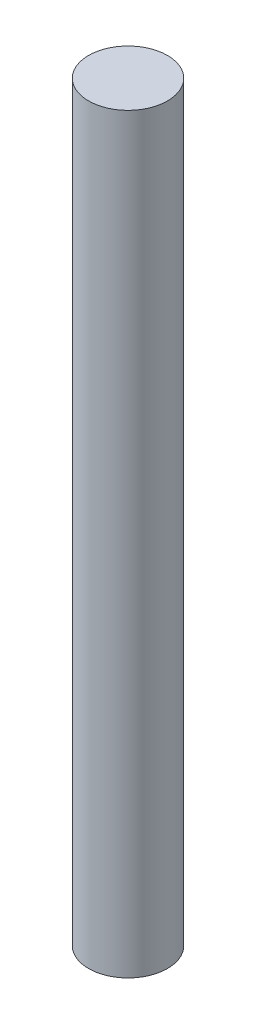
ISO-10303-21;
HEADER;
FILE_DESCRIPTION(('STEP AP214'),'2;1');
FILE_NAME('part.step','',(''),(''),'','','');
FILE_SCHEMA(('AUTOMOTIVE_DESIGN { 1 0 10303 214 1 1 1 1 }'));
ENDSEC;
DATA;
#1=APPLICATION_CONTEXT('core data for automotive mechanical design processes');
#2=APPLICATION_PROTOCOL_DEFINITION('international standard','automotive_design',2000,#1);
#3=PRODUCT_CONTEXT('',#1,'mechanical');
#4=PRODUCT('Part','Part','',(#3));
#5=PRODUCT_RELATED_PRODUCT_CATEGORY('part','',(#4));
#6=PRODUCT_DEFINITION_FORMATION('','',#4);
#7=PRODUCT_DEFINITION_CONTEXT('part definition',#1,'design');
#8=PRODUCT_DEFINITION('design','',#6,#7);
#9=PRODUCT_DEFINITION_SHAPE('','',#8);
#10=(LENGTH_UNIT() NAMED_UNIT(*) SI_UNIT(.MILLI.,.METRE.));
#11=(NAMED_UNIT(*) PLANE_ANGLE_UNIT() SI_UNIT($,.RADIAN.));
#12=(NAMED_UNIT(*) SI_UNIT($,.STERADIAN.) SOLID_ANGLE_UNIT());
#13=UNCERTAINTY_MEASURE_WITH_UNIT(LENGTH_MEASURE(1.E-05),#10,'distance_accuracy_value','');
#14=(GEOMETRIC_REPRESENTATION_CONTEXT(3) GLOBAL_UNCERTAINTY_ASSIGNED_CONTEXT((#13)) GLOBAL_UNIT_ASSIGNED_CONTEXT((#10,
#11,#12)) REPRESENTATION_CONTEXT('',''));
#15=CARTESIAN_POINT('',(0.,0.,0.));
#16=DIRECTION('',(0.,0.,1.));
#17=DIRECTION('',(1.,0.,0.));
#18=AXIS2_PLACEMENT_3D('',#15,#16,#17);
#19=CARTESIAN_POINT('',(0.,76.2,0.));
#20=DIRECTION('',(0.,-1.,0.));
#21=DIRECTION('',(0.,0.,-1.));
#22=AXIS2_PLACEMENT_3D('',#19,#20,#21);
#23=CYLINDRICAL_SURFACE('',#22,4.);
#24=CARTESIAN_POINT('',(0.,76.2,0.));
#25=DIRECTION('',(0.,1.,0.));
#26=DIRECTION('',(0.,0.,1.));
#27=AXIS2_PLACEMENT_3D('',#24,#25,#26);
#28=CIRCLE('',#27,4.);
#29=CARTESIAN_POINT('',(0.,76.2,-4.));
#30=VERTEX_POINT('',#29);
#31=EDGE_CURVE('E10',#30,#30,#28,.T.);
#32=CARTESIAN_POINT('',(0.,0.,0.));
#33=DIRECTION('',(0.,1.,0.));
#34=DIRECTION('',(0.,0.,1.));
#35=AXIS2_PLACEMENT_3D('',#32,#33,#34);
#36=CIRCLE('',#35,4.);
#37=CARTESIAN_POINT('',(0.,0.,-4.));
#38=VERTEX_POINT('',#37);
#39=EDGE_CURVE('E34',#38,#38,#36,.T.);
#40=CARTESIAN_POINT('',(0.,76.2,-4.));
#41=CARTESIAN_POINT('',(0.,75.40625,-4.));
#42=CARTESIAN_POINT('',(0.,74.6125,-4.));
#43=CARTESIAN_POINT('',(0.,73.025,-4.));
#44=CARTESIAN_POINT('',(0.,72.23125,-4.));
#45=CARTESIAN_POINT('',(0.,70.64375,-4.));
#46=CARTESIAN_POINT('',(0.,69.85,-4.));
#47=CARTESIAN_POINT('',(0.,68.2625,-4.));
#48=CARTESIAN_POINT('',(0.,67.46875,-4.));
#49=CARTESIAN_POINT('',(0.,65.88125,-4.));
#50=CARTESIAN_POINT('',(0.,65.0875,-4.));
#51=CARTESIAN_POINT('',(0.,63.5,-4.));
#52=CARTESIAN_POINT('',(0.,62.70625,-4.));
#53=CARTESIAN_POINT('',(0.,61.11875,-4.));
#54=CARTESIAN_POINT('',(0.,60.325,-4.));
#55=CARTESIAN_POINT('',(0.,58.7375,-4.));
#56=CARTESIAN_POINT('',(0.,57.94375,-4.));
#57=CARTESIAN_POINT('',(0.,56.35625,-4.));
#58=CARTESIAN_POINT('',(0.,55.5625,-4.));
#59=CARTESIAN_POINT('',(0.,53.975,-4.));
#60=CARTESIAN_POINT('',(0.,53.18125,-4.));
#61=CARTESIAN_POINT('',(0.,51.59375,-4.));
#62=CARTESIAN_POINT('',(0.,50.8,-4.));
#63=CARTESIAN_POINT('',(0.,49.2125,-4.));
#64=CARTESIAN_POINT('',(0.,48.41875,-4.));
#65=CARTESIAN_POINT('',(0.,46.83125,-4.));
#66=CARTESIAN_POINT('',(0.,46.0375,-4.));
#67=CARTESIAN_POINT('',(0.,44.45,-4.));
#68=CARTESIAN_POINT('',(0.,43.65625,-4.));
#69=CARTESIAN_POINT('',(0.,42.06875,-4.));
#70=CARTESIAN_POINT('',(0.,41.275,-4.));
#71=CARTESIAN_POINT('',(0.,39.6875,-4.));
#72=CARTESIAN_POINT('',(0.,38.89375,-4.));
#73=CARTESIAN_POINT('',(0.,37.30625,-4.));
#74=CARTESIAN_POINT('',(0.,36.5125,-4.));
#75=CARTESIAN_POINT('',(0.,34.925,-4.));
#76=CARTESIAN_POINT('',(0.,34.13125,-4.));
#77=CARTESIAN_POINT('',(0.,32.54375,-4.));
#78=CARTESIAN_POINT('',(0.,31.75,-4.));
#79=CARTESIAN_POINT('',(0.,30.1625,-4.));
#80=CARTESIAN_POINT('',(0.,29.36875,-4.));
#81=CARTESIAN_POINT('',(0.,27.78125,-4.));
#82=CARTESIAN_POINT('',(0.,26.9875,-4.));
#83=CARTESIAN_POINT('',(0.,25.4,-4.));
#84=CARTESIAN_POINT('',(0.,24.60625,-4.));
#85=CARTESIAN_POINT('',(0.,23.01875,-4.));
#86=CARTESIAN_POINT('',(0.,22.225,-4.));
#87=CARTESIAN_POINT('',(0.,20.6375,-4.));
#88=CARTESIAN_POINT('',(0.,19.84375,-4.));
#89=CARTESIAN_POINT('',(0.,18.25625,-4.));
#90=CARTESIAN_POINT('',(0.,17.4625,-4.));
#91=CARTESIAN_POINT('',(0.,15.875,-4.));
#92=CARTESIAN_POINT('',(0.,15.08125,-4.));
#93=CARTESIAN_POINT('',(0.,13.49375,-4.));
#94=CARTESIAN_POINT('',(0.,12.7,-4.));
#95=CARTESIAN_POINT('',(0.,11.1125,-4.));
#96=CARTESIAN_POINT('',(0.,10.31875,-4.));
#97=CARTESIAN_POINT('',(0.,8.73125,-4.));
#98=CARTESIAN_POINT('',(0.,7.93750000000001,-4.));
#99=CARTESIAN_POINT('',(0.,6.35,-4.));
#100=CARTESIAN_POINT('',(0.,5.55625,-4.));
#101=CARTESIAN_POINT('',(0.,3.96875,-4.));
#102=CARTESIAN_POINT('',(0.,3.175,-4.));
#103=CARTESIAN_POINT('',(0.,1.5875,-4.));
#104=CARTESIAN_POINT('',(0.,0.793750000000001,-4.));
#105=CARTESIAN_POINT('',(0.,0.,-4.));
#106=B_SPLINE_CURVE_WITH_KNOTS('',3,(#40,#41,#42,#43,#44,#45,#46,#47,#48,#49,#50,#51,#52,#53,
#54,#55,#56,#57,#58,#59,#60,#61,#62,#63,#64,#65,#66,#67,#68,#69,#70,#71,#72,#73,#74,#75,#76,#77,
#78,#79,#80,#81,#82,#83,#84,#85,#86,#87,#88,#89,#90,#91,#92,#93,#94,#95,#96,#97,#98,#99,#100,
#101,#102,#103,#104,#105),.UNSPECIFIED.,.F.,.F.,(4,2,2,2,2,2,2,2,2,2,2,2,2,2,2,2,2,2,2,2,2,2,2,
2,2,2,2,2,2,2,2,2,4),(0.,2.38124999999999,4.76249999999999,7.14374999999999,9.52499999999999,
11.90625,14.2875,16.66875,19.05,21.43125,23.8125,26.19375,28.575,30.95625,33.3375,35.71875,38.1,
40.48125,42.8625,45.24375,47.625,50.00625,52.3875,54.76875,57.15,59.53125,61.9125,64.29375,
66.675,69.05625,71.4375,73.81875,76.2),.UNSPECIFIED.);
#107=EDGE_CURVE('BSEAM31',#30,#38,#106,.T.);
#108=ORIENTED_EDGE('',*,*,#31,.F.);
#109=ORIENTED_EDGE('',*,*,#39,.T.);
#110=ORIENTED_EDGE('',*,*,#107,.T.);
#111=ORIENTED_EDGE('',*,*,#107,.F.);
#112=EDGE_LOOP('',(#108,#110,#109,#111));
#113=FACE_BOUND('',#112,.T.);
#114=ADVANCED_FACE('F31',(#113),#23,.T.);
#115=CARTESIAN_POINT('',(0.,76.2,0.));
#116=DIRECTION('',(0.,1.,0.));
#117=DIRECTION('',(0.,0.,1.));
#118=AXIS2_PLACEMENT_3D('',#115,#116,#117);
#119=PLANE('',#118);
#120=ORIENTED_EDGE('',*,*,#31,.T.);
#121=EDGE_LOOP('',(#120));
#122=FACE_BOUND('',#121,.T.);
#123=ADVANCED_FACE('F46',(#122),#119,.T.);
#124=CARTESIAN_POINT('',(0.,0.,0.));
#125=DIRECTION('',(0.,1.,0.));
#126=DIRECTION('',(0.,0.,1.));
#127=AXIS2_PLACEMENT_3D('',#124,#125,#126);
#128=PLANE('',#127);
#129=ORIENTED_EDGE('',*,*,#39,.F.);
#130=EDGE_LOOP('',(#129));
#131=FACE_BOUND('',#130,.T.);
#132=ADVANCED_FACE('F44',(#131),#128,.F.);
#133=CLOSED_SHELL('',(#114,#123,#132));
#134=MANIFOLD_SOLID_BREP('B2',#133);
#135=ADVANCED_BREP_SHAPE_REPRESENTATION('',(#18,#134),#14);
#136=SHAPE_DEFINITION_REPRESENTATION(#9,#135);
ENDSEC;
END-ISO-10303-21;
